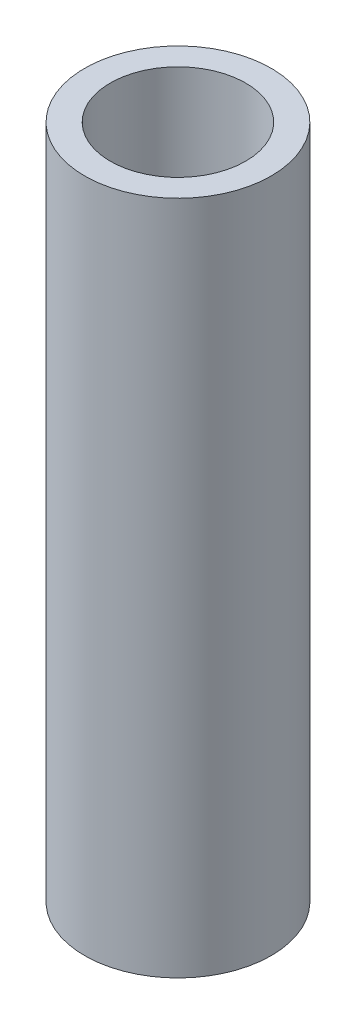
ISO-10303-21;
HEADER;
FILE_DESCRIPTION(('STEP AP214'),'2;1');
FILE_NAME('part.step','',(''),(''),'','','');
FILE_SCHEMA(('AUTOMOTIVE_DESIGN { 1 0 10303 214 1 1 1 1 }'));
ENDSEC;
DATA;
#1=APPLICATION_CONTEXT('core data for automotive mechanical design processes');
#2=APPLICATION_PROTOCOL_DEFINITION('international standard','automotive_design',2000,#1);
#3=PRODUCT_CONTEXT('',#1,'mechanical');
#4=PRODUCT('Part','Part','',(#3));
#5=PRODUCT_RELATED_PRODUCT_CATEGORY('part','',(#4));
#6=PRODUCT_DEFINITION_FORMATION('','',#4);
#7=PRODUCT_DEFINITION_CONTEXT('part definition',#1,'design');
#8=PRODUCT_DEFINITION('design','',#6,#7);
#9=PRODUCT_DEFINITION_SHAPE('','',#8);
#10=(LENGTH_UNIT() NAMED_UNIT(*) SI_UNIT(.MILLI.,.METRE.));
#11=(NAMED_UNIT(*) PLANE_ANGLE_UNIT() SI_UNIT($,.RADIAN.));
#12=(NAMED_UNIT(*) SI_UNIT($,.STERADIAN.) SOLID_ANGLE_UNIT());
#13=UNCERTAINTY_MEASURE_WITH_UNIT(LENGTH_MEASURE(1.E-05),#10,'distance_accuracy_value','');
#14=(GEOMETRIC_REPRESENTATION_CONTEXT(3) GLOBAL_UNCERTAINTY_ASSIGNED_CONTEXT((#13)) GLOBAL_UNIT_ASSIGNED_CONTEXT((#10,
#11,#12)) REPRESENTATION_CONTEXT('',''));
#15=CARTESIAN_POINT('',(0.,0.,0.));
#16=DIRECTION('',(0.,0.,1.));
#17=DIRECTION('',(1.,0.,0.));
#18=AXIS2_PLACEMENT_3D('',#15,#16,#17);
#19=CARTESIAN_POINT('',(-4.2,0.,0.));
#20=DIRECTION('',(0.,1.,0.));
#21=DIRECTION('',(-1.,0.,0.));
#22=AXIS2_PLACEMENT_3D('',#19,#20,#21);
#23=PLANE('',#22);
#24=CARTESIAN_POINT('',(0.,0.,0.));
#25=DIRECTION('',(0.,-1.,0.));
#26=DIRECTION('',(1.,0.,0.));
#27=AXIS2_PLACEMENT_3D('',#24,#25,#26);
#28=CIRCLE('',#27,3.4);
#29=CARTESIAN_POINT('',(3.4,0.,0.));
#30=VERTEX_POINT('',#29);
#31=EDGE_CURVE('E10',#30,#30,#28,.T.);
#32=ORIENTED_EDGE('',*,*,#31,.F.);
#33=EDGE_LOOP('',(#32));
#34=FACE_BOUND('',#33,.T.);
#35=CARTESIAN_POINT('',(0.,0.,0.));
#36=DIRECTION('',(0.,-1.,0.));
#37=DIRECTION('',(1.,0.,0.));
#38=AXIS2_PLACEMENT_3D('',#35,#36,#37);
#39=CIRCLE('',#38,4.2);
#40=CARTESIAN_POINT('',(4.2,0.,0.));
#41=VERTEX_POINT('',#40);
#42=EDGE_CURVE('E55',#41,#41,#39,.T.);
#43=ORIENTED_EDGE('',*,*,#42,.T.);
#44=EDGE_LOOP('',(#43));
#45=FACE_BOUND('',#44,.T.);
#46=ADVANCED_FACE('F33',(#34,#45),#23,.F.);
#47=CARTESIAN_POINT('',(0.,0.,0.));
#48=DIRECTION('',(0.,-1.,0.));
#49=DIRECTION('',(1.,0.,0.));
#50=AXIS2_PLACEMENT_3D('',#47,#48,#49);
#51=CYLINDRICAL_SURFACE('',#50,3.4);
#52=CARTESIAN_POINT('',(0.,15.,0.));
#53=DIRECTION('',(0.,-1.,0.));
#54=DIRECTION('',(1.,0.,0.));
#55=AXIS2_PLACEMENT_3D('',#52,#53,#54);
#56=CIRCLE('',#55,3.4);
#57=CARTESIAN_POINT('',(3.39999999999999,15.,0.));
#58=VERTEX_POINT('',#57);
#59=EDGE_CURVE('E39',#58,#58,#56,.T.);
#60=ORIENTED_EDGE('',*,*,#59,.F.);
#61=EDGE_LOOP('',(#60));
#62=FACE_BOUND('',#61,.T.);
#63=ORIENTED_EDGE('',*,*,#31,.T.);
#64=EDGE_LOOP('',(#63));
#65=FACE_BOUND('',#64,.T.);
#66=ADVANCED_FACE('F85',(#62,#65),#51,.F.);
#67=CARTESIAN_POINT('',(-3.4,15.,0.));
#68=DIRECTION('',(0.,1.,0.));
#69=DIRECTION('',(-1.,0.,0.));
#70=AXIS2_PLACEMENT_3D('',#67,#68,#69);
#71=PLANE('',#70);
#72=ORIENTED_EDGE('',*,*,#59,.T.);
#73=EDGE_LOOP('',(#72));
#74=FACE_BOUND('',#73,.T.);
#75=ADVANCED_FACE('F80',(#74),#71,.F.);
#76=CARTESIAN_POINT('',(0.,15.4,0.));
#77=DIRECTION('',(0.,-1.,0.));
#78=DIRECTION('',(1.,0.,0.));
#79=AXIS2_PLACEMENT_3D('',#76,#77,#78);
#80=PLANE('',#79);
#81=CARTESIAN_POINT('',(0.,15.4,0.));
#82=DIRECTION('',(0.,-1.,0.));
#83=DIRECTION('',(1.,0.,0.));
#84=AXIS2_PLACEMENT_3D('',#81,#82,#83);
#85=CIRCLE('',#84,3.05);
#86=CARTESIAN_POINT('',(3.04999999999999,15.4,0.));
#87=VERTEX_POINT('',#86);
#88=EDGE_CURVE('E43',#87,#87,#85,.T.);
#89=ORIENTED_EDGE('',*,*,#88,.F.);
#90=EDGE_LOOP('',(#89));
#91=FACE_BOUND('',#90,.T.);
#92=ADVANCED_FACE('F75',(#91),#80,.F.);
#93=CARTESIAN_POINT('',(0.,0.,0.));
#94=DIRECTION('',(0.,-1.,0.));
#95=DIRECTION('',(1.,0.,0.));
#96=AXIS2_PLACEMENT_3D('',#93,#94,#95);
#97=CYLINDRICAL_SURFACE('',#96,3.05);
#98=CARTESIAN_POINT('',(0.,30.4,0.));
#99=DIRECTION('',(0.,-1.,0.));
#100=DIRECTION('',(1.,0.,0.));
#101=AXIS2_PLACEMENT_3D('',#98,#99,#100);
#102=CIRCLE('',#101,3.04999999999999);
#103=CARTESIAN_POINT('',(3.04999999999999,30.4,0.));
#104=VERTEX_POINT('',#103);
#105=EDGE_CURVE('E47',#104,#104,#102,.T.);
#106=ORIENTED_EDGE('',*,*,#105,.F.);
#107=EDGE_LOOP('',(#106));
#108=FACE_BOUND('',#107,.T.);
#109=ORIENTED_EDGE('',*,*,#88,.T.);
#110=EDGE_LOOP('',(#109));
#111=FACE_BOUND('',#110,.T.);
#112=ADVANCED_FACE('F69',(#108,#111),#97,.F.);
#113=CARTESIAN_POINT('',(-3.05,30.4,0.));
#114=DIRECTION('',(0.,-1.,0.));
#115=DIRECTION('',(1.,0.,0.));
#116=AXIS2_PLACEMENT_3D('',#113,#114,#115);
#117=PLANE('',#116);
#118=CARTESIAN_POINT('',(0.,30.4,0.));
#119=DIRECTION('',(0.,-1.,0.));
#120=DIRECTION('',(1.,0.,0.));
#121=AXIS2_PLACEMENT_3D('',#118,#119,#120);
#122=CIRCLE('',#121,4.2);
#123=CARTESIAN_POINT('',(4.19999999999999,30.4,0.));
#124=VERTEX_POINT('',#123);
#125=EDGE_CURVE('E52',#124,#124,#122,.T.);
#126=ORIENTED_EDGE('',*,*,#125,.F.);
#127=EDGE_LOOP('',(#126));
#128=FACE_BOUND('',#127,.T.);
#129=ORIENTED_EDGE('',*,*,#105,.T.);
#130=EDGE_LOOP('',(#129));
#131=FACE_BOUND('',#130,.T.);
#132=ADVANCED_FACE('F63',(#128,#131),#117,.F.);
#133=CARTESIAN_POINT('',(0.,0.,0.));
#134=DIRECTION('',(0.,-1.,0.));
#135=DIRECTION('',(1.,0.,0.));
#136=AXIS2_PLACEMENT_3D('',#133,#134,#135);
#137=CYLINDRICAL_SURFACE('',#136,4.2);
#138=ORIENTED_EDGE('',*,*,#42,.F.);
#139=EDGE_LOOP('',(#138));
#140=FACE_BOUND('',#139,.T.);
#141=ORIENTED_EDGE('',*,*,#125,.T.);
#142=EDGE_LOOP('',(#141));
#143=FACE_BOUND('',#142,.T.);
#144=ADVANCED_FACE('F60',(#140,#143),#137,.T.);
#145=CLOSED_SHELL('',(#46,#66,#75,#92,#112,#132,#144));
#146=MANIFOLD_SOLID_BREP('B2',#145);
#147=ADVANCED_BREP_SHAPE_REPRESENTATION('',(#18,#146),#14);
#148=SHAPE_DEFINITION_REPRESENTATION(#9,#147);
ENDSEC;
END-ISO-10303-21;
